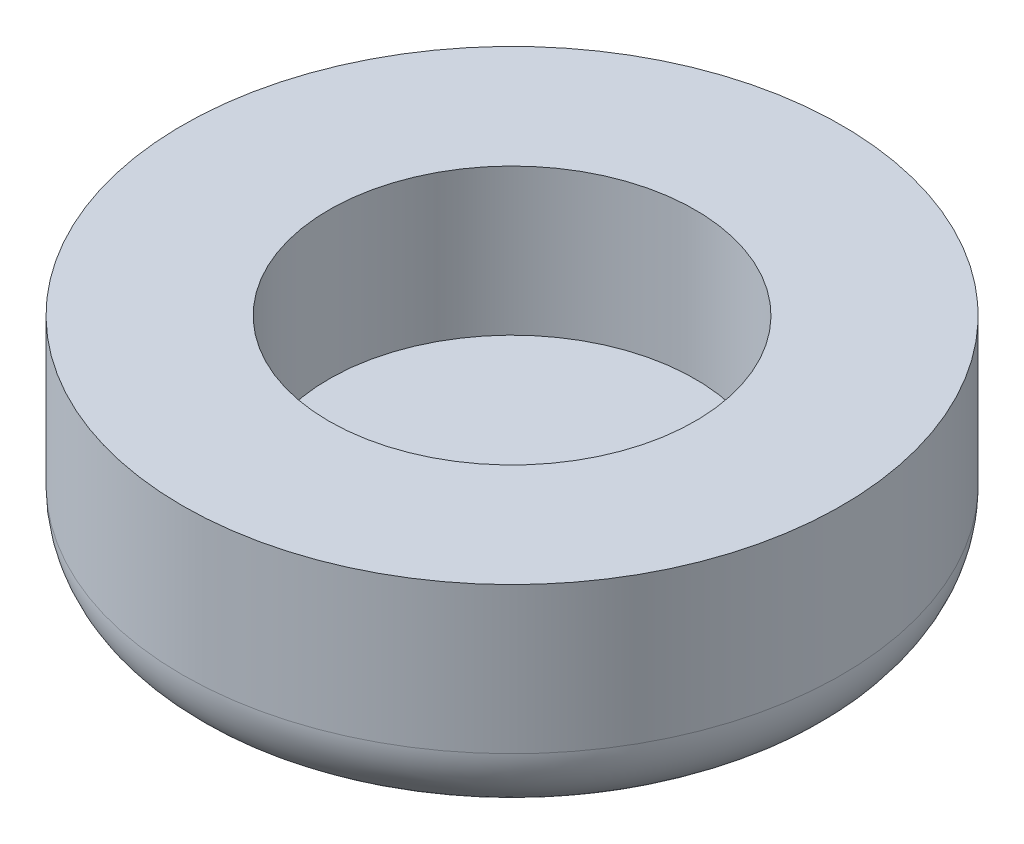
ISO-10303-21;
HEADER;
FILE_DESCRIPTION(('STEP AP214'),'2;1');
FILE_NAME('part.step','',(''),(''),'','','');
FILE_SCHEMA(('AUTOMOTIVE_DESIGN { 1 0 10303 214 1 1 1 1 }'));
ENDSEC;
DATA;
#1=APPLICATION_CONTEXT('core data for automotive mechanical design processes');
#2=APPLICATION_PROTOCOL_DEFINITION('international standard','automotive_design',2000,#1);
#3=PRODUCT_CONTEXT('',#1,'mechanical');
#4=PRODUCT('Part','Part','',(#3));
#5=PRODUCT_RELATED_PRODUCT_CATEGORY('part','',(#4));
#6=PRODUCT_DEFINITION_FORMATION('','',#4);
#7=PRODUCT_DEFINITION_CONTEXT('part definition',#1,'design');
#8=PRODUCT_DEFINITION('design','',#6,#7);
#9=PRODUCT_DEFINITION_SHAPE('','',#8);
#10=(LENGTH_UNIT() NAMED_UNIT(*) SI_UNIT(.MILLI.,.METRE.));
#11=(NAMED_UNIT(*) PLANE_ANGLE_UNIT() SI_UNIT($,.RADIAN.));
#12=(NAMED_UNIT(*) SI_UNIT($,.STERADIAN.) SOLID_ANGLE_UNIT());
#13=UNCERTAINTY_MEASURE_WITH_UNIT(LENGTH_MEASURE(1.E-05),#10,'distance_accuracy_value','');
#14=(GEOMETRIC_REPRESENTATION_CONTEXT(3) GLOBAL_UNCERTAINTY_ASSIGNED_CONTEXT((#13)) GLOBAL_UNIT_ASSIGNED_CONTEXT((#10,
#11,#12)) REPRESENTATION_CONTEXT('',''));
#15=CARTESIAN_POINT('',(0.,0.,0.));
#16=DIRECTION('',(0.,0.,1.));
#17=DIRECTION('',(1.,0.,0.));
#18=AXIS2_PLACEMENT_3D('',#15,#16,#17);
#19=CARTESIAN_POINT('',(0.,3.,0.));
#20=DIRECTION('',(0.,-1.,0.));
#21=DIRECTION('',(0.,0.,-1.));
#22=AXIS2_PLACEMENT_3D('',#19,#20,#21);
#23=CYLINDRICAL_SURFACE('',#22,4.5);
#24=CARTESIAN_POINT('',(0.,1.,0.));
#25=DIRECTION('',(0.,1.,0.));
#26=DIRECTION('',(0.,0.,1.));
#27=AXIS2_PLACEMENT_3D('',#24,#25,#26);
#28=CIRCLE('',#27,4.5);
#29=CARTESIAN_POINT('',(0.,1.,4.5));
#30=VERTEX_POINT('',#29);
#31=EDGE_CURVE('E42',#30,#30,#28,.T.);
#32=ORIENTED_EDGE('',*,*,#31,.T.);
#33=EDGE_LOOP('',(#32));
#34=FACE_BOUND('',#33,.T.);
#35=CARTESIAN_POINT('',(0.,3.,0.));
#36=DIRECTION('',(0.,1.,0.));
#37=DIRECTION('',(0.,0.,1.));
#38=AXIS2_PLACEMENT_3D('',#35,#36,#37);
#39=CIRCLE('',#38,4.5);
#40=CARTESIAN_POINT('',(0.,3.,4.5));
#41=VERTEX_POINT('',#40);
#42=EDGE_CURVE('E46',#41,#41,#39,.T.);
#43=ORIENTED_EDGE('',*,*,#42,.F.);
#44=EDGE_LOOP('',(#43));
#45=FACE_BOUND('',#44,.T.);
#46=ADVANCED_FACE('F35',(#34,#45),#23,.T.);
#47=CARTESIAN_POINT('',(0.,3.,0.));
#48=DIRECTION('',(0.,1.,0.));
#49=DIRECTION('',(0.,0.,1.));
#50=AXIS2_PLACEMENT_3D('',#47,#48,#49);
#51=PLANE('',#50);
#52=CARTESIAN_POINT('',(0.,3.,0.));
#53=DIRECTION('',(0.,1.,0.));
#54=DIRECTION('',(0.,0.,1.));
#55=AXIS2_PLACEMENT_3D('',#52,#53,#54);
#56=CIRCLE('',#55,2.5);
#57=CARTESIAN_POINT('',(0.,3.,2.5));
#58=VERTEX_POINT('',#57);
#59=EDGE_CURVE('E53',#58,#58,#56,.T.);
#60=ORIENTED_EDGE('',*,*,#59,.F.);
#61=EDGE_LOOP('',(#60));
#62=FACE_BOUND('',#61,.T.);
#63=ORIENTED_EDGE('',*,*,#42,.T.);
#64=EDGE_LOOP('',(#63));
#65=FACE_BOUND('',#64,.T.);
#66=ADVANCED_FACE('F68',(#62,#65),#51,.T.);
#67=CARTESIAN_POINT('',(0.,0.,0.));
#68=DIRECTION('',(0.,1.,0.));
#69=DIRECTION('',(0.,0.,1.));
#70=AXIS2_PLACEMENT_3D('',#67,#68,#69);
#71=PLANE('',#70);
#72=CARTESIAN_POINT('',(0.,0.,0.));
#73=DIRECTION('',(0.,1.,0.));
#74=DIRECTION('',(0.,0.,1.));
#75=AXIS2_PLACEMENT_3D('',#72,#73,#74);
#76=CIRCLE('',#75,3.5);
#77=CARTESIAN_POINT('',(0.,0.,3.5));
#78=VERTEX_POINT('',#77);
#79=EDGE_CURVE('E10',#78,#78,#76,.F.);
#80=ORIENTED_EDGE('',*,*,#79,.T.);
#81=EDGE_LOOP('',(#80));
#82=FACE_BOUND('',#81,.T.);
#83=ADVANCED_FACE('F64',(#82),#71,.F.);
#84=CARTESIAN_POINT('',(0.,1.,0.));
#85=DIRECTION('',(0.,1.,0.));
#86=DIRECTION('',(0.,0.,1.));
#87=AXIS2_PLACEMENT_3D('',#84,#85,#86);
#88=CYLINDRICAL_SURFACE('',#87,2.5);
#89=CARTESIAN_POINT('',(0.,1.,0.));
#90=DIRECTION('',(0.,1.,0.));
#91=DIRECTION('',(0.,0.,1.));
#92=AXIS2_PLACEMENT_3D('',#89,#90,#91);
#93=CIRCLE('',#92,2.5);
#94=CARTESIAN_POINT('',(0.,1.,2.5));
#95=VERTEX_POINT('',#94);
#96=EDGE_CURVE('E50',#95,#95,#93,.T.);
#97=ORIENTED_EDGE('',*,*,#96,.F.);
#98=EDGE_LOOP('',(#97));
#99=FACE_BOUND('',#98,.T.);
#100=ORIENTED_EDGE('',*,*,#59,.T.);
#101=EDGE_LOOP('',(#100));
#102=FACE_BOUND('',#101,.T.);
#103=ADVANCED_FACE('F61',(#99,#102),#88,.F.);
#104=CARTESIAN_POINT('',(0.,1.,0.));
#105=DIRECTION('',(0.,1.,0.));
#106=DIRECTION('',(0.,0.,1.));
#107=AXIS2_PLACEMENT_3D('',#104,#105,#106);
#108=PLANE('',#107);
#109=ORIENTED_EDGE('',*,*,#96,.T.);
#110=EDGE_LOOP('',(#109));
#111=FACE_BOUND('',#110,.T.);
#112=ADVANCED_FACE('F59',(#111),#108,.T.);
#113=CARTESIAN_POINT('',(0.,1.,0.));
#114=DIRECTION('',(0.,1.,0.));
#115=DIRECTION('',(0.,0.,1.));
#116=AXIS2_PLACEMENT_3D('',#113,#114,#115);
#117=TOROIDAL_SURFACE('',#116,3.5,1.);
#118=ORIENTED_EDGE('',*,*,#79,.F.);
#119=EDGE_LOOP('',(#118));
#120=FACE_BOUND('',#119,.T.);
#121=ORIENTED_EDGE('',*,*,#31,.F.);
#122=EDGE_LOOP('',(#121));
#123=FACE_BOUND('',#122,.T.);
#124=ADVANCED_FACE('F37',(#120,#123),#117,.T.);
#125=CLOSED_SHELL('',(#46,#66,#83,#103,#112,#124));
#126=MANIFOLD_SOLID_BREP('B2',#125);
#127=ADVANCED_BREP_SHAPE_REPRESENTATION('',(#18,#126),#14);
#128=SHAPE_DEFINITION_REPRESENTATION(#9,#127);
ENDSEC;
END-ISO-10303-21;
